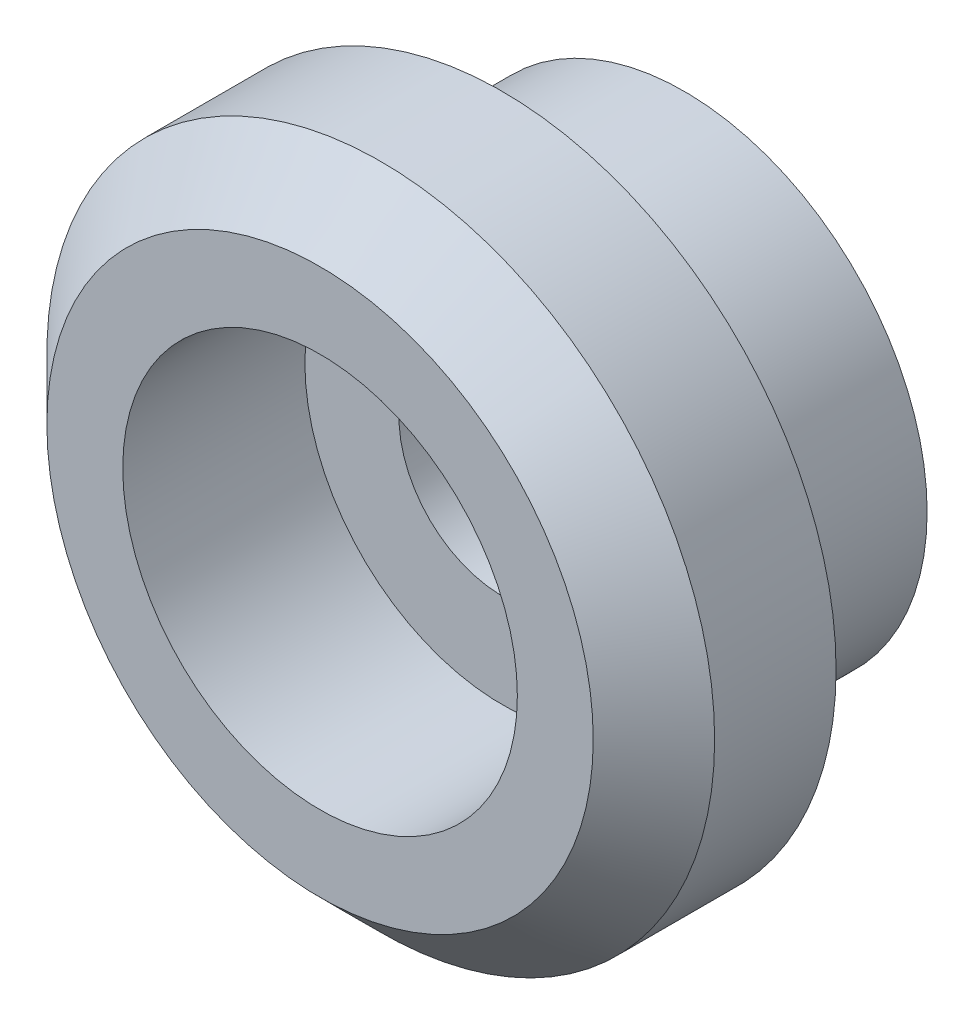
ISO-10303-21;
HEADER;
FILE_DESCRIPTION(('STEP AP214'),'2;1');
FILE_NAME('part.step','',(''),(''),'','','');
FILE_SCHEMA(('AUTOMOTIVE_DESIGN { 1 0 10303 214 1 1 1 1 }'));
ENDSEC;
DATA;
#1=APPLICATION_CONTEXT('core data for automotive mechanical design processes');
#2=APPLICATION_PROTOCOL_DEFINITION('international standard','automotive_design',2000,#1);
#3=PRODUCT_CONTEXT('',#1,'mechanical');
#4=PRODUCT('Part','Part','',(#3));
#5=PRODUCT_RELATED_PRODUCT_CATEGORY('part','',(#4));
#6=PRODUCT_DEFINITION_FORMATION('','',#4);
#7=PRODUCT_DEFINITION_CONTEXT('part definition',#1,'design');
#8=PRODUCT_DEFINITION('design','',#6,#7);
#9=PRODUCT_DEFINITION_SHAPE('','',#8);
#10=(LENGTH_UNIT() NAMED_UNIT(*) SI_UNIT(.MILLI.,.METRE.));
#11=(NAMED_UNIT(*) PLANE_ANGLE_UNIT() SI_UNIT($,.RADIAN.));
#12=(NAMED_UNIT(*) SI_UNIT($,.STERADIAN.) SOLID_ANGLE_UNIT());
#13=UNCERTAINTY_MEASURE_WITH_UNIT(LENGTH_MEASURE(1.E-05),#10,'distance_accuracy_value','');
#14=(GEOMETRIC_REPRESENTATION_CONTEXT(3) GLOBAL_UNCERTAINTY_ASSIGNED_CONTEXT((#13)) GLOBAL_UNIT_ASSIGNED_CONTEXT((#10,
#11,#12)) REPRESENTATION_CONTEXT('',''));
#15=CARTESIAN_POINT('',(0.,0.,0.));
#16=DIRECTION('',(0.,0.,1.));
#17=DIRECTION('',(1.,0.,0.));
#18=AXIS2_PLACEMENT_3D('',#15,#16,#17);
#19=CARTESIAN_POINT('',(0.,0.,3.));
#20=DIRECTION('',(0.,0.,-1.));
#21=DIRECTION('',(-1.,0.,0.));
#22=AXIS2_PLACEMENT_3D('',#19,#20,#21);
#23=CYLINDRICAL_SURFACE('',#22,4.);
#24=CARTESIAN_POINT('',(0.,0.,3.));
#25=DIRECTION('',(0.,0.,1.));
#26=DIRECTION('',(1.,0.,0.));
#27=AXIS2_PLACEMENT_3D('',#24,#25,#26);
#28=CIRCLE('',#27,4.);
#29=CARTESIAN_POINT('',(4.,0.,3.));
#30=VERTEX_POINT('',#29);
#31=EDGE_CURVE('E41',#30,#30,#28,.T.);
#32=ORIENTED_EDGE('',*,*,#31,.F.);
#33=EDGE_LOOP('',(#32));
#34=FACE_BOUND('',#33,.T.);
#35=CARTESIAN_POINT('',(0.,0.,0.));
#36=DIRECTION('',(0.,0.,1.));
#37=DIRECTION('',(1.,0.,0.));
#38=AXIS2_PLACEMENT_3D('',#35,#36,#37);
#39=CIRCLE('',#38,4.);
#40=CARTESIAN_POINT('',(4.,0.,0.));
#41=VERTEX_POINT('',#40);
#42=EDGE_CURVE('E45',#41,#41,#39,.T.);
#43=ORIENTED_EDGE('',*,*,#42,.T.);
#44=EDGE_LOOP('',(#43));
#45=FACE_BOUND('',#44,.T.);
#46=ADVANCED_FACE('F30',(#34,#45),#23,.T.);
#47=CARTESIAN_POINT('',(0.,0.,0.));
#48=DIRECTION('',(0.,0.,1.));
#49=DIRECTION('',(1.,0.,0.));
#50=AXIS2_PLACEMENT_3D('',#47,#48,#49);
#51=PLANE('',#50);
#52=CARTESIAN_POINT('',(0.,0.,0.));
#53=DIRECTION('',(0.,0.,1.));
#54=DIRECTION('',(1.,0.,0.));
#55=AXIS2_PLACEMENT_3D('',#52,#53,#54);
#56=CIRCLE('',#55,1.7);
#57=CARTESIAN_POINT('',(1.7,0.,0.));
#58=VERTEX_POINT('',#57);
#59=EDGE_CURVE('E53',#58,#58,#56,.T.);
#60=ORIENTED_EDGE('',*,*,#59,.T.);
#61=EDGE_LOOP('',(#60));
#62=FACE_BOUND('',#61,.T.);
#63=ORIENTED_EDGE('',*,*,#42,.F.);
#64=EDGE_LOOP('',(#63));
#65=FACE_BOUND('',#64,.T.);
#66=ADVANCED_FACE('F84',(#62,#65),#51,.F.);
#67=CARTESIAN_POINT('',(0.,0.,3.));
#68=DIRECTION('',(0.,0.,1.));
#69=DIRECTION('',(1.,0.,0.));
#70=AXIS2_PLACEMENT_3D('',#67,#68,#69);
#71=PLANE('',#70);
#72=CARTESIAN_POINT('',(0.,0.,3.));
#73=DIRECTION('',(0.,0.,1.));
#74=DIRECTION('',(1.,0.,0.));
#75=AXIS2_PLACEMENT_3D('',#72,#73,#74);
#76=CIRCLE('',#75,5.5);
#77=CARTESIAN_POINT('',(5.5,0.,3.));
#78=VERTEX_POINT('',#77);
#79=EDGE_CURVE('E49',#78,#78,#76,.T.);
#80=ORIENTED_EDGE('',*,*,#79,.F.);
#81=EDGE_LOOP('',(#80));
#82=FACE_BOUND('',#81,.T.);
#83=ORIENTED_EDGE('',*,*,#31,.T.);
#84=EDGE_LOOP('',(#83));
#85=FACE_BOUND('',#84,.T.);
#86=ADVANCED_FACE('F80',(#82,#85),#71,.F.);
#87=CARTESIAN_POINT('',(0.,0.,6.));
#88=DIRECTION('',(0.,0.,-1.));
#89=DIRECTION('',(-1.,0.,0.));
#90=AXIS2_PLACEMENT_3D('',#87,#88,#89);
#91=CYLINDRICAL_SURFACE('',#90,5.5);
#92=CARTESIAN_POINT('',(0.,0.,5.));
#93=DIRECTION('',(0.,0.,1.));
#94=DIRECTION('',(1.,0.,0.));
#95=AXIS2_PLACEMENT_3D('',#92,#93,#94);
#96=CIRCLE('',#95,5.5);
#97=CARTESIAN_POINT('',(5.5,0.,5.));
#98=VERTEX_POINT('',#97);
#99=EDGE_CURVE('E10',#98,#98,#96,.F.);
#100=ORIENTED_EDGE('',*,*,#99,.T.);
#101=EDGE_LOOP('',(#100));
#102=FACE_BOUND('',#101,.T.);
#103=ORIENTED_EDGE('',*,*,#79,.T.);
#104=EDGE_LOOP('',(#103));
#105=FACE_BOUND('',#104,.T.);
#106=ADVANCED_FACE('F71',(#102,#105),#91,.T.);
#107=CARTESIAN_POINT('',(0.,0.,6.));
#108=DIRECTION('',(0.,0.,1.));
#109=DIRECTION('',(1.,0.,0.));
#110=AXIS2_PLACEMENT_3D('',#107,#108,#109);
#111=PLANE('',#110);
#112=CARTESIAN_POINT('',(0.,0.,6.));
#113=DIRECTION('',(0.,0.,1.));
#114=DIRECTION('',(1.,0.,0.));
#115=AXIS2_PLACEMENT_3D('',#112,#113,#114);
#116=CIRCLE('',#115,4.50000000000001);
#117=CARTESIAN_POINT('',(4.50000000000001,0.,6.));
#118=VERTEX_POINT('',#117);
#119=EDGE_CURVE('E37',#118,#118,#116,.T.);
#120=ORIENTED_EDGE('',*,*,#119,.T.);
#121=EDGE_LOOP('',(#120));
#122=FACE_BOUND('',#121,.T.);
#123=CARTESIAN_POINT('',(0.,0.,6.));
#124=DIRECTION('',(0.,0.,1.));
#125=DIRECTION('',(1.,0.,0.));
#126=AXIS2_PLACEMENT_3D('',#123,#124,#125);
#127=CIRCLE('',#126,3.25);
#128=CARTESIAN_POINT('',(3.25,0.,6.));
#129=VERTEX_POINT('',#128);
#130=EDGE_CURVE('E62',#129,#129,#127,.T.);
#131=ORIENTED_EDGE('',*,*,#130,.F.);
#132=EDGE_LOOP('',(#131));
#133=FACE_BOUND('',#132,.T.);
#134=ADVANCED_FACE('F68',(#122,#133),#111,.T.);
#135=CARTESIAN_POINT('',(0.,0.,6.));
#136=DIRECTION('',(0.,0.,1.));
#137=DIRECTION('',(1.,0.,0.));
#138=AXIS2_PLACEMENT_3D('',#135,#136,#137);
#139=CYLINDRICAL_SURFACE('',#138,1.7);
#140=ORIENTED_EDGE('',*,*,#59,.F.);
#141=EDGE_LOOP('',(#140));
#142=FACE_BOUND('',#141,.T.);
#143=CARTESIAN_POINT('',(0.,0.,3.));
#144=DIRECTION('',(0.,0.,1.));
#145=DIRECTION('',(1.,0.,0.));
#146=AXIS2_PLACEMENT_3D('',#143,#144,#145);
#147=CIRCLE('',#146,1.7);
#148=CARTESIAN_POINT('',(1.7,0.,3.));
#149=VERTEX_POINT('',#148);
#150=EDGE_CURVE('E56',#149,#149,#147,.T.);
#151=ORIENTED_EDGE('',*,*,#150,.T.);
#152=EDGE_LOOP('',(#151));
#153=FACE_BOUND('',#152,.T.);
#154=ADVANCED_FACE('F70',(#142,#153),#139,.F.);
#155=CARTESIAN_POINT('',(1.7,0.,3.));
#156=DIRECTION('',(0.,0.,-1.));
#157=DIRECTION('',(-1.,0.,0.));
#158=AXIS2_PLACEMENT_3D('',#155,#156,#157);
#159=PLANE('',#158);
#160=ORIENTED_EDGE('',*,*,#150,.F.);
#161=EDGE_LOOP('',(#160));
#162=FACE_BOUND('',#161,.T.);
#163=CARTESIAN_POINT('',(0.,0.,3.));
#164=DIRECTION('',(0.,0.,1.));
#165=DIRECTION('',(1.,0.,0.));
#166=AXIS2_PLACEMENT_3D('',#163,#164,#165);
#167=CIRCLE('',#166,3.25);
#168=CARTESIAN_POINT('',(3.25,0.,3.));
#169=VERTEX_POINT('',#168);
#170=EDGE_CURVE('E59',#169,#169,#167,.T.);
#171=ORIENTED_EDGE('',*,*,#170,.T.);
#172=EDGE_LOOP('',(#171));
#173=FACE_BOUND('',#172,.T.);
#174=ADVANCED_FACE('F77',(#162,#173),#159,.F.);
#175=CARTESIAN_POINT('',(0.,0.,6.));
#176=DIRECTION('',(0.,0.,1.));
#177=DIRECTION('',(1.,0.,0.));
#178=AXIS2_PLACEMENT_3D('',#175,#176,#177);
#179=CYLINDRICAL_SURFACE('',#178,3.25);
#180=ORIENTED_EDGE('',*,*,#170,.F.);
#181=EDGE_LOOP('',(#180));
#182=FACE_BOUND('',#181,.T.);
#183=ORIENTED_EDGE('',*,*,#130,.T.);
#184=EDGE_LOOP('',(#183));
#185=FACE_BOUND('',#184,.T.);
#186=ADVANCED_FACE('F66',(#182,#185),#179,.F.);
#187=CARTESIAN_POINT('',(0.,0.,6.));
#188=DIRECTION('',(0.,0.,-1.));
#189=DIRECTION('',(-1.,0.,0.));
#190=AXIS2_PLACEMENT_3D('',#187,#188,#189);
#191=CONICAL_SURFACE('',#190,4.50000000000001,0.785398163397445);
#192=ORIENTED_EDGE('',*,*,#99,.F.);
#193=EDGE_LOOP('',(#192));
#194=FACE_BOUND('',#193,.T.);
#195=ORIENTED_EDGE('',*,*,#119,.F.);
#196=EDGE_LOOP('',(#195));
#197=FACE_BOUND('',#196,.T.);
#198=ADVANCED_FACE('F32',(#194,#197),#191,.T.);
#199=CLOSED_SHELL('',(#46,#66,#86,#106,#134,#154,#174,#186,#198));
#200=MANIFOLD_SOLID_BREP('B2',#199);
#201=ADVANCED_BREP_SHAPE_REPRESENTATION('',(#18,#200),#14);
#202=SHAPE_DEFINITION_REPRESENTATION(#9,#201);
ENDSEC;
END-ISO-10303-21;
